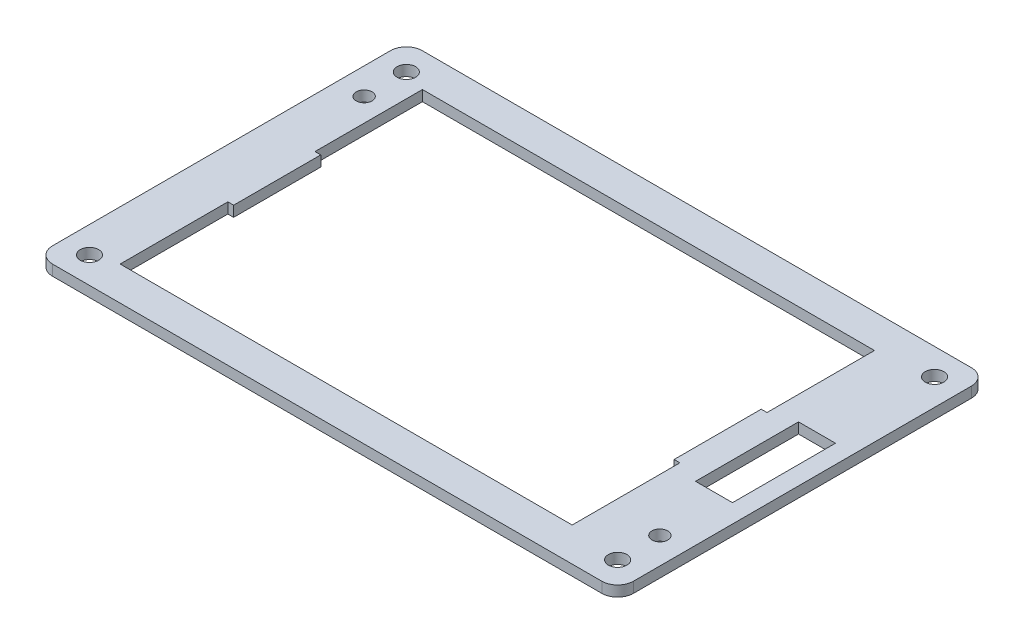
ISO-10303-21;
HEADER;
FILE_DESCRIPTION(('STEP AP214'),'2;1');
FILE_NAME('part.step','',(''),(''),'','','');
FILE_SCHEMA(('AUTOMOTIVE_DESIGN { 1 0 10303 214 1 1 1 1 }'));
ENDSEC;
DATA;
#1=APPLICATION_CONTEXT('core data for automotive mechanical design processes');
#2=APPLICATION_PROTOCOL_DEFINITION('international standard','automotive_design',2000,#1);
#3=PRODUCT_CONTEXT('',#1,'mechanical');
#4=PRODUCT('Part','Part','',(#3));
#5=PRODUCT_RELATED_PRODUCT_CATEGORY('part','',(#4));
#6=PRODUCT_DEFINITION_FORMATION('','',#4);
#7=PRODUCT_DEFINITION_CONTEXT('part definition',#1,'design');
#8=PRODUCT_DEFINITION('design','',#6,#7);
#9=PRODUCT_DEFINITION_SHAPE('','',#8);
#10=(LENGTH_UNIT() NAMED_UNIT(*) SI_UNIT(.MILLI.,.METRE.));
#11=(NAMED_UNIT(*) PLANE_ANGLE_UNIT() SI_UNIT($,.RADIAN.));
#12=(NAMED_UNIT(*) SI_UNIT($,.STERADIAN.) SOLID_ANGLE_UNIT());
#13=UNCERTAINTY_MEASURE_WITH_UNIT(LENGTH_MEASURE(1.E-05),#10,'distance_accuracy_value','');
#14=(GEOMETRIC_REPRESENTATION_CONTEXT(3) GLOBAL_UNCERTAINTY_ASSIGNED_CONTEXT((#13)) GLOBAL_UNIT_ASSIGNED_CONTEXT((#10,
#11,#12)) REPRESENTATION_CONTEXT('',''));
#15=CARTESIAN_POINT('',(0.,0.,0.));
#16=DIRECTION('',(0.,0.,1.));
#17=DIRECTION('',(1.,0.,0.));
#18=AXIS2_PLACEMENT_3D('',#15,#16,#17);
#19=CARTESIAN_POINT('',(0.,2.,0.));
#20=DIRECTION('',(0.,1.,0.));
#21=DIRECTION('',(0.,0.,1.));
#22=AXIS2_PLACEMENT_3D('',#19,#20,#21);
#23=PLANE('',#22);
#24=CARTESIAN_POINT('',(-50.,2.,-22.));
#25=DIRECTION('',(0.,-1.,0.));
#26=DIRECTION('',(0.,0.,-1.));
#27=AXIS2_PLACEMENT_3D('',#24,#25,#26);
#28=CIRCLE('',#27,1.5);
#29=CARTESIAN_POINT('',(-50.,2.,-23.5));
#30=VERTEX_POINT('',#29);
#31=EDGE_CURVE('E791',#30,#30,#28,.T.);
#32=ORIENTED_EDGE('',*,*,#31,.T.);
#33=EDGE_LOOP('',(#32));
#34=FACE_BOUND('',#33,.T.);
#35=CARTESIAN_POINT('',(50.,2.,22.));
#36=DIRECTION('',(0.,-1.,0.));
#37=DIRECTION('',(0.,0.,-1.));
#38=AXIS2_PLACEMENT_3D('',#35,#36,#37);
#39=CIRCLE('',#38,1.5);
#40=CARTESIAN_POINT('',(50.,2.,20.5));
#41=VERTEX_POINT('',#40);
#42=EDGE_CURVE('E231',#41,#41,#39,.T.);
#43=ORIENTED_EDGE('',*,*,#42,.T.);
#44=EDGE_LOOP('',(#43));
#45=FACE_BOUND('',#44,.T.);
#46=DIRECTION('',(0.,0.,1.));
#47=VECTOR('',#46,1.);
#48=CARTESIAN_POINT('',(44.5,2.,9.75000000000002));
#49=LINE('',#48,#47);
#50=CARTESIAN_POINT('',(44.5,2.,-9.74999999999998));
#51=VERTEX_POINT('',#50);
#52=CARTESIAN_POINT('',(44.5,2.,9.75000000000002));
#53=VERTEX_POINT('',#52);
#54=EDGE_CURVE('E200',#51,#53,#49,.T.);
#55=ORIENTED_EDGE('',*,*,#54,.F.);
#56=DIRECTION('',(-1.,0.,0.));
#57=VECTOR('',#56,1.);
#58=CARTESIAN_POINT('',(44.5,2.,-9.74999999999998));
#59=LINE('',#58,#57);
#60=CARTESIAN_POINT('',(51.5,2.,-9.74999999999998));
#61=VERTEX_POINT('',#60);
#62=EDGE_CURVE('E218',#61,#51,#59,.T.);
#63=ORIENTED_EDGE('',*,*,#62,.F.);
#64=DIRECTION('',(0.,0.,-1.));
#65=VECTOR('',#64,1.);
#66=CARTESIAN_POINT('',(51.5,2.,9.75000000000002));
#67=LINE('',#66,#65);
#68=CARTESIAN_POINT('',(51.5,2.,9.75000000000002));
#69=VERTEX_POINT('',#68);
#70=EDGE_CURVE('E221',#69,#61,#67,.T.);
#71=ORIENTED_EDGE('',*,*,#70,.F.);
#72=DIRECTION('',(1.,0.,0.));
#73=VECTOR('',#72,1.);
#74=CARTESIAN_POINT('',(44.5,2.,9.75000000000002));
#75=LINE('',#74,#73);
#76=EDGE_CURVE('E230',#53,#69,#75,.T.);
#77=ORIENTED_EDGE('',*,*,#76,.F.);
#78=EDGE_LOOP('',(#55,#63,#71,#77));
#79=FACE_BOUND('',#78,.T.);
#80=CARTESIAN_POINT('',(50.,2.,30.));
#81=DIRECTION('',(0.,1.,0.));
#82=DIRECTION('',(0.,0.,1.));
#83=AXIS2_PLACEMENT_3D('',#80,#81,#82);
#84=CIRCLE('',#83,1.75);
#85=CARTESIAN_POINT('',(50.,2.,31.75));
#86=VERTEX_POINT('',#85);
#87=EDGE_CURVE('E334',#86,#86,#84,.T.);
#88=ORIENTED_EDGE('',*,*,#87,.F.);
#89=EDGE_LOOP('',(#88));
#90=FACE_BOUND('',#89,.T.);
#91=CARTESIAN_POINT('',(-50.,2.,-30.));
#92=DIRECTION('',(0.,1.,0.));
#93=DIRECTION('',(0.,0.,1.));
#94=AXIS2_PLACEMENT_3D('',#91,#92,#93);
#95=CIRCLE('',#94,1.75);
#96=CARTESIAN_POINT('',(-50.,2.,-28.25));
#97=VERTEX_POINT('',#96);
#98=EDGE_CURVE('E346',#97,#97,#95,.T.);
#99=ORIENTED_EDGE('',*,*,#98,.F.);
#100=EDGE_LOOP('',(#99));
#101=FACE_BOUND('',#100,.T.);
#102=DIRECTION('',(-1.,0.,0.));
#103=VECTOR('',#102,1.);
#104=CARTESIAN_POINT('',(-55.,2.,-35.));
#105=LINE('',#104,#103);
#106=CARTESIAN_POINT('',(52.,2.,-35.0000000000001));
#107=VERTEX_POINT('',#106);
#108=CARTESIAN_POINT('',(-52.,2.,-35.));
#109=VERTEX_POINT('',#108);
#110=EDGE_CURVE('E360',#107,#109,#105,.T.);
#111=ORIENTED_EDGE('',*,*,#110,.T.);
#112=CARTESIAN_POINT('',(-52.,2.,-32.));
#113=DIRECTION('',(0.,1.,0.));
#114=DIRECTION('',(0.,0.,1.));
#115=AXIS2_PLACEMENT_3D('',#112,#113,#114);
#116=CIRCLE('',#115,3.);
#117=CARTESIAN_POINT('',(-55.,2.,-32.));
#118=VERTEX_POINT('',#117);
#119=EDGE_CURVE('E395',#109,#118,#116,.T.);
#120=ORIENTED_EDGE('',*,*,#119,.T.);
#121=DIRECTION('',(0.,0.,1.));
#122=VECTOR('',#121,1.);
#123=CARTESIAN_POINT('',(-55.,2.,-35.));
#124=LINE('',#123,#122);
#125=CARTESIAN_POINT('',(-55.,2.,32.));
#126=VERTEX_POINT('',#125);
#127=EDGE_CURVE('E352',#118,#126,#124,.T.);
#128=ORIENTED_EDGE('',*,*,#127,.T.);
#129=CARTESIAN_POINT('',(-52.,2.,32.));
#130=DIRECTION('',(0.,1.,0.));
#131=DIRECTION('',(0.,0.,1.));
#132=AXIS2_PLACEMENT_3D('',#129,#130,#131);
#133=CIRCLE('',#132,3.);
#134=CARTESIAN_POINT('',(-52.,2.,35.));
#135=VERTEX_POINT('',#134);
#136=EDGE_CURVE('E393',#126,#135,#133,.T.);
#137=ORIENTED_EDGE('',*,*,#136,.T.);
#138=DIRECTION('',(1.,0.,0.));
#139=VECTOR('',#138,1.);
#140=CARTESIAN_POINT('',(-55.,2.,35.));
#141=LINE('',#140,#139);
#142=CARTESIAN_POINT('',(52.,2.,35.));
#143=VERTEX_POINT('',#142);
#144=EDGE_CURVE('E355',#135,#143,#141,.T.);
#145=ORIENTED_EDGE('',*,*,#144,.T.);
#146=CARTESIAN_POINT('',(52.,2.,32.));
#147=DIRECTION('',(0.,1.,0.));
#148=DIRECTION('',(0.,0.,1.));
#149=AXIS2_PLACEMENT_3D('',#146,#147,#148);
#150=CIRCLE('',#149,3.);
#151=CARTESIAN_POINT('',(55.,2.,32.));
#152=VERTEX_POINT('',#151);
#153=EDGE_CURVE('E52',#143,#152,#150,.T.);
#154=ORIENTED_EDGE('',*,*,#153,.T.);
#155=DIRECTION('',(0.,0.,-1.));
#156=VECTOR('',#155,1.);
#157=CARTESIAN_POINT('',(55.,2.,-35.0000000000001));
#158=LINE('',#157,#156);
#159=CARTESIAN_POINT('',(55.,2.,-32.0000000000001));
#160=VERTEX_POINT('',#159);
#161=EDGE_CURVE('E358',#152,#160,#158,.T.);
#162=ORIENTED_EDGE('',*,*,#161,.T.);
#163=CARTESIAN_POINT('',(52.,2.,-32.0000000000001));
#164=DIRECTION('',(0.,1.,0.));
#165=DIRECTION('',(0.,0.,1.));
#166=AXIS2_PLACEMENT_3D('',#163,#164,#165);
#167=CIRCLE('',#166,3.);
#168=EDGE_CURVE('E391',#160,#107,#167,.T.);
#169=ORIENTED_EDGE('',*,*,#168,.T.);
#170=EDGE_LOOP('',(#111,#120,#128,#137,#145,#154,#162,#169));
#171=FACE_BOUND('',#170,.T.);
#172=CARTESIAN_POINT('',(-50.,2.,30.));
#173=DIRECTION('',(0.,1.,0.));
#174=DIRECTION('',(0.,0.,1.));
#175=AXIS2_PLACEMENT_3D('',#172,#173,#174);
#176=CIRCLE('',#175,1.75);
#177=CARTESIAN_POINT('',(-50.,2.,31.75));
#178=VERTEX_POINT('',#177);
#179=EDGE_CURVE('E340',#178,#178,#176,.T.);
#180=ORIENTED_EDGE('',*,*,#179,.F.);
#181=EDGE_LOOP('',(#180));
#182=FACE_BOUND('',#181,.T.);
#183=CARTESIAN_POINT('',(50.,2.,-30.));
#184=DIRECTION('',(0.,1.,0.));
#185=DIRECTION('',(0.,0.,1.));
#186=AXIS2_PLACEMENT_3D('',#183,#184,#185);
#187=CIRCLE('',#186,1.75);
#188=CARTESIAN_POINT('',(50.,2.,-28.25));
#189=VERTEX_POINT('',#188);
#190=EDGE_CURVE('E328',#189,#189,#187,.T.);
#191=ORIENTED_EDGE('',*,*,#190,.F.);
#192=EDGE_LOOP('',(#191));
#193=FACE_BOUND('',#192,.T.);
#194=DIRECTION('',(-1.,0.,0.));
#195=VECTOR('',#194,1.);
#196=CARTESIAN_POINT('',(39.9847783768724,2.,-28.642854689921));
#197=LINE('',#196,#195);
#198=CARTESIAN_POINT('',(39.9847783768724,2.,-28.642854689921));
#199=VERTEX_POINT('',#198);
#200=CARTESIAN_POINT('',(-45.6030332068906,2.,-28.642854689921));
#201=VERTEX_POINT('',#200);
#202=EDGE_CURVE('E243',#199,#201,#197,.T.);
#203=ORIENTED_EDGE('',*,*,#202,.F.);
#204=DIRECTION('',(0.,0.,-1.));
#205=VECTOR('',#204,1.);
#206=CARTESIAN_POINT('',(39.9847783768724,2.,-8.29978499806222));
#207=LINE('',#206,#205);
#208=CARTESIAN_POINT('',(39.9847783768724,2.,-8.29978499806222));
#209=VERTEX_POINT('',#208);
#210=EDGE_CURVE('E241',#209,#199,#207,.T.);
#211=ORIENTED_EDGE('',*,*,#210,.F.);
#212=DIRECTION('',(1.,0.,0.));
#213=VECTOR('',#212,1.);
#214=CARTESIAN_POINT('',(38.89,2.,-8.29978499806221));
#215=LINE('',#214,#213);
#216=CARTESIAN_POINT('',(38.89,2.,-8.29978499806221));
#217=VERTEX_POINT('',#216);
#218=EDGE_CURVE('E265',#217,#209,#215,.T.);
#219=ORIENTED_EDGE('',*,*,#218,.F.);
#220=DIRECTION('',(0.,0.,-1.));
#221=VECTOR('',#220,1.);
#222=CARTESIAN_POINT('',(38.89,2.,8.20021500193779));
#223=LINE('',#222,#221);
#224=CARTESIAN_POINT('',(38.89,2.,8.20021500193779));
#225=VERTEX_POINT('',#224);
#226=EDGE_CURVE('E262',#225,#217,#223,.T.);
#227=ORIENTED_EDGE('',*,*,#226,.F.);
#228=DIRECTION('',(-1.,0.,0.));
#229=VECTOR('',#228,1.);
#230=CARTESIAN_POINT('',(39.9847783768724,2.,8.20021500193779));
#231=LINE('',#230,#229);
#232=CARTESIAN_POINT('',(39.9847783768724,2.,8.20021500193779));
#233=VERTEX_POINT('',#232);
#234=EDGE_CURVE('E260',#233,#225,#231,.T.);
#235=ORIENTED_EDGE('',*,*,#234,.F.);
#236=DIRECTION('',(0.,0.,-1.));
#237=VECTOR('',#236,1.);
#238=CARTESIAN_POINT('',(39.9847783768724,2.,28.5912878880664));
#239=LINE('',#238,#237);
#240=CARTESIAN_POINT('',(39.9847783768724,2.,28.5912878880664));
#241=VERTEX_POINT('',#240);
#242=EDGE_CURVE('E258',#241,#233,#239,.T.);
#243=ORIENTED_EDGE('',*,*,#242,.F.);
#244=DIRECTION('',(1.,0.,0.));
#245=VECTOR('',#244,1.);
#246=CARTESIAN_POINT('',(-45.6030332068906,2.,28.5912878880664));
#247=LINE('',#246,#245);
#248=CARTESIAN_POINT('',(-45.6030332068906,2.,28.5912878880664));
#249=VERTEX_POINT('',#248);
#250=EDGE_CURVE('E256',#249,#241,#247,.T.);
#251=ORIENTED_EDGE('',*,*,#250,.F.);
#252=DIRECTION('',(0.,0.,1.));
#253=VECTOR('',#252,1.);
#254=CARTESIAN_POINT('',(-45.6030332068906,2.,8.20021500193779));
#255=LINE('',#254,#253);
#256=CARTESIAN_POINT('',(-45.6030332068906,2.,8.20021500193779));
#257=VERTEX_POINT('',#256);
#258=EDGE_CURVE('E254',#257,#249,#255,.T.);
#259=ORIENTED_EDGE('',*,*,#258,.F.);
#260=DIRECTION('',(-1.,0.,0.));
#261=VECTOR('',#260,1.);
#262=CARTESIAN_POINT('',(-44.51,2.,8.20021500193779));
#263=LINE('',#262,#261);
#264=CARTESIAN_POINT('',(-44.51,2.,8.20021500193779));
#265=VERTEX_POINT('',#264);
#266=EDGE_CURVE('E252',#265,#257,#263,.T.);
#267=ORIENTED_EDGE('',*,*,#266,.F.);
#268=DIRECTION('',(0.,0.,1.));
#269=VECTOR('',#268,1.);
#270=CARTESIAN_POINT('',(-44.51,2.,-8.29978499806221));
#271=LINE('',#270,#269);
#272=CARTESIAN_POINT('',(-44.51,2.,-8.29978499806221));
#273=VERTEX_POINT('',#272);
#274=EDGE_CURVE('E250',#273,#265,#271,.T.);
#275=ORIENTED_EDGE('',*,*,#274,.F.);
#276=DIRECTION('',(1.,0.,0.));
#277=VECTOR('',#276,1.);
#278=CARTESIAN_POINT('',(-45.6030332068906,2.,-8.29978499806222));
#279=LINE('',#278,#277);
#280=CARTESIAN_POINT('',(-45.6030332068906,2.,-8.29978499806222));
#281=VERTEX_POINT('',#280);
#282=EDGE_CURVE('E248',#281,#273,#279,.T.);
#283=ORIENTED_EDGE('',*,*,#282,.F.);
#284=DIRECTION('',(0.,0.,1.));
#285=VECTOR('',#284,1.);
#286=CARTESIAN_POINT('',(-45.6030332068906,2.,-28.642854689921));
#287=LINE('',#286,#285);
#288=EDGE_CURVE('E246',#201,#281,#287,.T.);
#289=ORIENTED_EDGE('',*,*,#288,.F.);
#290=EDGE_LOOP('',(#203,#211,#219,#227,#235,#243,#251,#259,#267,#275,#283,#289));
#291=FACE_BOUND('',#290,.T.);
#292=ADVANCED_FACE('F32',(#34,#45,#79,#90,#101,#171,#182,#193,#291),#23,.T.);
#293=CARTESIAN_POINT('',(0.,0.,0.));
#294=DIRECTION('',(0.,1.,0.));
#295=DIRECTION('',(0.,0.,1.));
#296=AXIS2_PLACEMENT_3D('',#293,#294,#295);
#297=PLANE('',#296);
#298=CARTESIAN_POINT('',(-50.,0.,-22.));
#299=DIRECTION('',(0.,-1.,0.));
#300=DIRECTION('',(0.,0.,-1.));
#301=AXIS2_PLACEMENT_3D('',#298,#299,#300);
#302=CIRCLE('',#301,1.5);
#303=CARTESIAN_POINT('',(-50.,0.,-23.5));
#304=VERTEX_POINT('',#303);
#305=EDGE_CURVE('E794',#304,#304,#302,.T.);
#306=ORIENTED_EDGE('',*,*,#305,.F.);
#307=EDGE_LOOP('',(#306));
#308=FACE_BOUND('',#307,.T.);
#309=CARTESIAN_POINT('',(50.,0.,22.));
#310=DIRECTION('',(0.,-1.,0.));
#311=DIRECTION('',(0.,0.,-1.));
#312=AXIS2_PLACEMENT_3D('',#309,#310,#311);
#313=CIRCLE('',#312,1.5);
#314=CARTESIAN_POINT('',(50.,0.,20.5));
#315=VERTEX_POINT('',#314);
#316=EDGE_CURVE('E224',#315,#315,#313,.T.);
#317=ORIENTED_EDGE('',*,*,#316,.F.);
#318=EDGE_LOOP('',(#317));
#319=FACE_BOUND('',#318,.T.);
#320=DIRECTION('',(-1.,0.,0.));
#321=VECTOR('',#320,1.);
#322=CARTESIAN_POINT('',(44.5,0.,-9.74999999999998));
#323=LINE('',#322,#321);
#324=CARTESIAN_POINT('',(51.5,0.,-9.74999999999998));
#325=VERTEX_POINT('',#324);
#326=CARTESIAN_POINT('',(44.5,0.,-9.74999999999998));
#327=VERTEX_POINT('',#326);
#328=EDGE_CURVE('E205',#325,#327,#323,.T.);
#329=ORIENTED_EDGE('',*,*,#328,.T.);
#330=DIRECTION('',(0.,0.,1.));
#331=VECTOR('',#330,1.);
#332=CARTESIAN_POINT('',(44.5,0.,9.75000000000002));
#333=LINE('',#332,#331);
#334=CARTESIAN_POINT('',(44.5,0.,9.75000000000002));
#335=VERTEX_POINT('',#334);
#336=EDGE_CURVE('E197',#327,#335,#333,.T.);
#337=ORIENTED_EDGE('',*,*,#336,.T.);
#338=DIRECTION('',(1.,0.,0.));
#339=VECTOR('',#338,1.);
#340=CARTESIAN_POINT('',(44.5,0.,9.75000000000002));
#341=LINE('',#340,#339);
#342=CARTESIAN_POINT('',(51.5,0.,9.75000000000002));
#343=VERTEX_POINT('',#342);
#344=EDGE_CURVE('E209',#335,#343,#341,.T.);
#345=ORIENTED_EDGE('',*,*,#344,.T.);
#346=DIRECTION('',(0.,0.,-1.));
#347=VECTOR('',#346,1.);
#348=CARTESIAN_POINT('',(51.5,0.,9.75000000000002));
#349=LINE('',#348,#347);
#350=EDGE_CURVE('E213',#343,#325,#349,.T.);
#351=ORIENTED_EDGE('',*,*,#350,.T.);
#352=EDGE_LOOP('',(#329,#337,#345,#351));
#353=FACE_BOUND('',#352,.T.);
#354=CARTESIAN_POINT('',(50.,0.,-30.));
#355=DIRECTION('',(0.,1.,0.));
#356=DIRECTION('',(0.,0.,1.));
#357=AXIS2_PLACEMENT_3D('',#354,#355,#356);
#358=CIRCLE('',#357,1.75);
#359=CARTESIAN_POINT('',(50.,0.,-28.25));
#360=VERTEX_POINT('',#359);
#361=EDGE_CURVE('E327',#360,#360,#358,.T.);
#362=ORIENTED_EDGE('',*,*,#361,.T.);
#363=EDGE_LOOP('',(#362));
#364=FACE_BOUND('',#363,.T.);
#365=CARTESIAN_POINT('',(50.,0.,30.));
#366=DIRECTION('',(0.,1.,0.));
#367=DIRECTION('',(0.,0.,1.));
#368=AXIS2_PLACEMENT_3D('',#365,#366,#367);
#369=CIRCLE('',#368,1.75);
#370=CARTESIAN_POINT('',(50.,0.,31.75));
#371=VERTEX_POINT('',#370);
#372=EDGE_CURVE('E331',#371,#371,#369,.T.);
#373=ORIENTED_EDGE('',*,*,#372,.T.);
#374=EDGE_LOOP('',(#373));
#375=FACE_BOUND('',#374,.T.);
#376=CARTESIAN_POINT('',(-50.,0.,30.));
#377=DIRECTION('',(0.,1.,0.));
#378=DIRECTION('',(0.,0.,1.));
#379=AXIS2_PLACEMENT_3D('',#376,#377,#378);
#380=CIRCLE('',#379,1.75);
#381=CARTESIAN_POINT('',(-50.,0.,31.75));
#382=VERTEX_POINT('',#381);
#383=EDGE_CURVE('E337',#382,#382,#380,.T.);
#384=ORIENTED_EDGE('',*,*,#383,.T.);
#385=EDGE_LOOP('',(#384));
#386=FACE_BOUND('',#385,.T.);
#387=CARTESIAN_POINT('',(-50.,0.,-30.));
#388=DIRECTION('',(0.,1.,0.));
#389=DIRECTION('',(0.,0.,1.));
#390=AXIS2_PLACEMENT_3D('',#387,#388,#389);
#391=CIRCLE('',#390,1.75);
#392=CARTESIAN_POINT('',(-50.,0.,-28.25));
#393=VERTEX_POINT('',#392);
#394=EDGE_CURVE('E343',#393,#393,#391,.T.);
#395=ORIENTED_EDGE('',*,*,#394,.T.);
#396=EDGE_LOOP('',(#395));
#397=FACE_BOUND('',#396,.T.);
#398=DIRECTION('',(0.,0.,1.));
#399=VECTOR('',#398,1.);
#400=CARTESIAN_POINT('',(-55.,0.,-35.));
#401=LINE('',#400,#399);
#402=CARTESIAN_POINT('',(-55.,0.,-32.));
#403=VERTEX_POINT('',#402);
#404=CARTESIAN_POINT('',(-55.,0.,32.));
#405=VERTEX_POINT('',#404);
#406=EDGE_CURVE('E349',#403,#405,#401,.T.);
#407=ORIENTED_EDGE('',*,*,#406,.F.);
#408=CARTESIAN_POINT('',(-52.,0.,-32.));
#409=DIRECTION('',(0.,1.,0.));
#410=DIRECTION('',(0.,0.,1.));
#411=AXIS2_PLACEMENT_3D('',#408,#409,#410);
#412=CIRCLE('',#411,3.);
#413=CARTESIAN_POINT('',(-52.,0.,-35.));
#414=VERTEX_POINT('',#413);
#415=EDGE_CURVE('E383',#403,#414,#412,.F.);
#416=ORIENTED_EDGE('',*,*,#415,.T.);
#417=DIRECTION('',(-1.,0.,0.));
#418=VECTOR('',#417,1.);
#419=CARTESIAN_POINT('',(-55.,0.,-35.));
#420=LINE('',#419,#418);
#421=CARTESIAN_POINT('',(52.,0.,-35.0000000000001));
#422=VERTEX_POINT('',#421);
#423=EDGE_CURVE('E356',#422,#414,#420,.T.);
#424=ORIENTED_EDGE('',*,*,#423,.F.);
#425=CARTESIAN_POINT('',(52.,0.,-32.0000000000001));
#426=DIRECTION('',(0.,1.,0.));
#427=DIRECTION('',(0.,0.,1.));
#428=AXIS2_PLACEMENT_3D('',#425,#426,#427);
#429=CIRCLE('',#428,3.);
#430=CARTESIAN_POINT('',(55.,0.,-32.0000000000001));
#431=VERTEX_POINT('',#430);
#432=EDGE_CURVE('E379',#422,#431,#429,.F.);
#433=ORIENTED_EDGE('',*,*,#432,.T.);
#434=DIRECTION('',(0.,0.,-1.));
#435=VECTOR('',#434,1.);
#436=CARTESIAN_POINT('',(55.,0.,-35.0000000000001));
#437=LINE('',#436,#435);
#438=CARTESIAN_POINT('',(55.,0.,32.));
#439=VERTEX_POINT('',#438);
#440=EDGE_CURVE('E369',#439,#431,#437,.T.);
#441=ORIENTED_EDGE('',*,*,#440,.F.);
#442=CARTESIAN_POINT('',(52.,0.,32.));
#443=DIRECTION('',(0.,1.,0.));
#444=DIRECTION('',(0.,0.,1.));
#445=AXIS2_PLACEMENT_3D('',#442,#443,#444);
#446=CIRCLE('',#445,3.);
#447=CARTESIAN_POINT('',(52.,0.,35.));
#448=VERTEX_POINT('',#447);
#449=EDGE_CURVE('E377',#439,#448,#446,.F.);
#450=ORIENTED_EDGE('',*,*,#449,.T.);
#451=DIRECTION('',(1.,0.,0.));
#452=VECTOR('',#451,1.);
#453=CARTESIAN_POINT('',(-55.,0.,35.));
#454=LINE('',#453,#452);
#455=CARTESIAN_POINT('',(-52.,0.,35.));
#456=VERTEX_POINT('',#455);
#457=EDGE_CURVE('E366',#456,#448,#454,.T.);
#458=ORIENTED_EDGE('',*,*,#457,.F.);
#459=CARTESIAN_POINT('',(-52.,0.,32.));
#460=DIRECTION('',(0.,1.,0.));
#461=DIRECTION('',(0.,0.,1.));
#462=AXIS2_PLACEMENT_3D('',#459,#460,#461);
#463=CIRCLE('',#462,3.);
#464=EDGE_CURVE('E381',#456,#405,#463,.F.);
#465=ORIENTED_EDGE('',*,*,#464,.T.);
#466=EDGE_LOOP('',(#407,#416,#424,#433,#441,#450,#458,#465));
#467=FACE_BOUND('',#466,.T.);
#468=DIRECTION('',(0.,0.,-1.));
#469=VECTOR('',#468,1.);
#470=CARTESIAN_POINT('',(39.9847783768724,0.,-8.29978499806222));
#471=LINE('',#470,#469);
#472=CARTESIAN_POINT('',(39.9847783768724,0.,-8.29978499806222));
#473=VERTEX_POINT('',#472);
#474=CARTESIAN_POINT('',(39.9847783768724,0.,-28.642854689921));
#475=VERTEX_POINT('',#474);
#476=EDGE_CURVE('E237',#473,#475,#471,.T.);
#477=ORIENTED_EDGE('',*,*,#476,.T.);
#478=DIRECTION('',(-1.,0.,0.));
#479=VECTOR('',#478,1.);
#480=CARTESIAN_POINT('',(39.9847783768724,0.,-28.642854689921));
#481=LINE('',#480,#479);
#482=CARTESIAN_POINT('',(-45.6030332068906,0.,-28.642854689921));
#483=VERTEX_POINT('',#482);
#484=EDGE_CURVE('E270',#475,#483,#481,.T.);
#485=ORIENTED_EDGE('',*,*,#484,.T.);
#486=DIRECTION('',(0.,0.,1.));
#487=VECTOR('',#486,1.);
#488=CARTESIAN_POINT('',(-45.6030332068906,0.,-28.642854689921));
#489=LINE('',#488,#487);
#490=CARTESIAN_POINT('',(-45.6030332068906,0.,-8.29978499806222));
#491=VERTEX_POINT('',#490);
#492=EDGE_CURVE('E273',#483,#491,#489,.T.);
#493=ORIENTED_EDGE('',*,*,#492,.T.);
#494=DIRECTION('',(1.,0.,0.));
#495=VECTOR('',#494,1.);
#496=CARTESIAN_POINT('',(-45.6030332068906,0.,-8.29978499806222));
#497=LINE('',#496,#495);
#498=CARTESIAN_POINT('',(-44.51,0.,-8.29978499806221));
#499=VERTEX_POINT('',#498);
#500=EDGE_CURVE('E276',#491,#499,#497,.T.);
#501=ORIENTED_EDGE('',*,*,#500,.T.);
#502=DIRECTION('',(0.,0.,1.));
#503=VECTOR('',#502,1.);
#504=CARTESIAN_POINT('',(-44.51,0.,-8.29978499806221));
#505=LINE('',#504,#503);
#506=CARTESIAN_POINT('',(-44.51,0.,8.20021500193779));
#507=VERTEX_POINT('',#506);
#508=EDGE_CURVE('E279',#499,#507,#505,.T.);
#509=ORIENTED_EDGE('',*,*,#508,.T.);
#510=DIRECTION('',(-1.,0.,0.));
#511=VECTOR('',#510,1.);
#512=CARTESIAN_POINT('',(-44.51,0.,8.20021500193779));
#513=LINE('',#512,#511);
#514=CARTESIAN_POINT('',(-45.6030332068906,0.,8.20021500193779));
#515=VERTEX_POINT('',#514);
#516=EDGE_CURVE('E282',#507,#515,#513,.T.);
#517=ORIENTED_EDGE('',*,*,#516,.T.);
#518=DIRECTION('',(0.,0.,1.));
#519=VECTOR('',#518,1.);
#520=CARTESIAN_POINT('',(-45.6030332068906,0.,8.20021500193779));
#521=LINE('',#520,#519);
#522=CARTESIAN_POINT('',(-45.6030332068906,0.,28.5912878880664));
#523=VERTEX_POINT('',#522);
#524=EDGE_CURVE('E285',#515,#523,#521,.T.);
#525=ORIENTED_EDGE('',*,*,#524,.T.);
#526=DIRECTION('',(1.,0.,0.));
#527=VECTOR('',#526,1.);
#528=CARTESIAN_POINT('',(-45.6030332068906,0.,28.5912878880664));
#529=LINE('',#528,#527);
#530=CARTESIAN_POINT('',(39.9847783768724,0.,28.5912878880664));
#531=VERTEX_POINT('',#530);
#532=EDGE_CURVE('E288',#523,#531,#529,.T.);
#533=ORIENTED_EDGE('',*,*,#532,.T.);
#534=DIRECTION('',(0.,0.,-1.));
#535=VECTOR('',#534,1.);
#536=CARTESIAN_POINT('',(39.9847783768724,0.,28.5912878880664));
#537=LINE('',#536,#535);
#538=CARTESIAN_POINT('',(39.9847783768724,0.,8.20021500193779));
#539=VERTEX_POINT('',#538);
#540=EDGE_CURVE('E291',#531,#539,#537,.T.);
#541=ORIENTED_EDGE('',*,*,#540,.T.);
#542=DIRECTION('',(-1.,0.,0.));
#543=VECTOR('',#542,1.);
#544=CARTESIAN_POINT('',(39.9847783768724,0.,8.20021500193779));
#545=LINE('',#544,#543);
#546=CARTESIAN_POINT('',(38.89,0.,8.20021500193779));
#547=VERTEX_POINT('',#546);
#548=EDGE_CURVE('E294',#539,#547,#545,.T.);
#549=ORIENTED_EDGE('',*,*,#548,.T.);
#550=DIRECTION('',(0.,0.,-1.));
#551=VECTOR('',#550,1.);
#552=CARTESIAN_POINT('',(38.89,0.,8.20021500193779));
#553=LINE('',#552,#551);
#554=CARTESIAN_POINT('',(38.89,0.,-8.29978499806221));
#555=VERTEX_POINT('',#554);
#556=EDGE_CURVE('E297',#547,#555,#553,.T.);
#557=ORIENTED_EDGE('',*,*,#556,.T.);
#558=DIRECTION('',(1.,0.,0.));
#559=VECTOR('',#558,1.);
#560=CARTESIAN_POINT('',(38.89,0.,-8.29978499806221));
#561=LINE('',#560,#559);
#562=EDGE_CURVE('E244',#555,#473,#561,.T.);
#563=ORIENTED_EDGE('',*,*,#562,.T.);
#564=EDGE_LOOP('',(#477,#485,#493,#501,#509,#517,#525,#533,#541,#549,#557,#563));
#565=FACE_BOUND('',#564,.T.);
#566=ADVANCED_FACE('F215',(#308,#319,#353,#364,#375,#386,#397,#467,#565),#297,.F.);
#567=CARTESIAN_POINT('',(-55.,2.,-35.));
#568=DIRECTION('',(1.,0.,0.));
#569=DIRECTION('',(0.,0.,-1.));
#570=AXIS2_PLACEMENT_3D('',#567,#568,#569);
#571=PLANE('',#570);
#572=ORIENTED_EDGE('',*,*,#127,.F.);
#573=DIRECTION('',(0.,-1.,0.));
#574=VECTOR('',#573,1.);
#575=CARTESIAN_POINT('',(-55.,2.,-32.));
#576=LINE('',#575,#574);
#577=EDGE_CURVE('E374',#118,#403,#576,.T.);
#578=ORIENTED_EDGE('',*,*,#577,.T.);
#579=ORIENTED_EDGE('',*,*,#406,.T.);
#580=DIRECTION('',(0.,-1.,0.));
#581=VECTOR('',#580,1.);
#582=CARTESIAN_POINT('',(-55.,2.,32.));
#583=LINE('',#582,#581);
#584=EDGE_CURVE('E363',#405,#126,#583,.F.);
#585=ORIENTED_EDGE('',*,*,#584,.T.);
#586=EDGE_LOOP('',(#572,#578,#579,#585));
#587=FACE_BOUND('',#586,.T.);
#588=ADVANCED_FACE('F426',(#587),#571,.F.);
#589=CARTESIAN_POINT('',(-55.,2.,35.));
#590=DIRECTION('',(0.,0.,-1.));
#591=DIRECTION('',(-1.,0.,0.));
#592=AXIS2_PLACEMENT_3D('',#589,#590,#591);
#593=PLANE('',#592);
#594=ORIENTED_EDGE('',*,*,#144,.F.);
#595=DIRECTION('',(0.,-1.,0.));
#596=VECTOR('',#595,1.);
#597=CARTESIAN_POINT('',(-52.,2.,35.));
#598=LINE('',#597,#596);
#599=EDGE_CURVE('E399',#135,#456,#598,.T.);
#600=ORIENTED_EDGE('',*,*,#599,.T.);
#601=ORIENTED_EDGE('',*,*,#457,.T.);
#602=DIRECTION('',(0.,-1.,0.));
#603=VECTOR('',#602,1.);
#604=CARTESIAN_POINT('',(52.,2.,35.));
#605=LINE('',#604,#603);
#606=EDGE_CURVE('E397',#448,#143,#605,.F.);
#607=ORIENTED_EDGE('',*,*,#606,.T.);
#608=EDGE_LOOP('',(#594,#600,#601,#607));
#609=FACE_BOUND('',#608,.T.);
#610=ADVANCED_FACE('F434',(#609),#593,.F.);
#611=CARTESIAN_POINT('',(55.,2.,-35.0000000000001));
#612=DIRECTION('',(-1.,0.,0.));
#613=DIRECTION('',(0.,0.,1.));
#614=AXIS2_PLACEMENT_3D('',#611,#612,#613);
#615=PLANE('',#614);
#616=ORIENTED_EDGE('',*,*,#440,.T.);
#617=DIRECTION('',(0.,-1.,0.));
#618=VECTOR('',#617,1.);
#619=CARTESIAN_POINT('',(55.,2.,-32.0000000000001));
#620=LINE('',#619,#618);
#621=EDGE_CURVE('E11',#431,#160,#620,.F.);
#622=ORIENTED_EDGE('',*,*,#621,.T.);
#623=ORIENTED_EDGE('',*,*,#161,.F.);
#624=DIRECTION('',(0.,-1.,0.));
#625=VECTOR('',#624,1.);
#626=CARTESIAN_POINT('',(55.,2.,32.));
#627=LINE('',#626,#625);
#628=EDGE_CURVE('E40',#152,#439,#627,.T.);
#629=ORIENTED_EDGE('',*,*,#628,.T.);
#630=EDGE_LOOP('',(#616,#622,#623,#629));
#631=FACE_BOUND('',#630,.T.);
#632=ADVANCED_FACE('F404',(#631),#615,.F.);
#633=CARTESIAN_POINT('',(-55.,2.,-35.));
#634=DIRECTION('',(0.,0.,1.));
#635=DIRECTION('',(1.,0.,0.));
#636=AXIS2_PLACEMENT_3D('',#633,#634,#635);
#637=PLANE('',#636);
#638=ORIENTED_EDGE('',*,*,#423,.T.);
#639=DIRECTION('',(0.,-1.,0.));
#640=VECTOR('',#639,1.);
#641=CARTESIAN_POINT('',(-52.,2.,-35.));
#642=LINE('',#641,#640);
#643=EDGE_CURVE('E388',#414,#109,#642,.F.);
#644=ORIENTED_EDGE('',*,*,#643,.T.);
#645=ORIENTED_EDGE('',*,*,#110,.F.);
#646=DIRECTION('',(0.,-1.,0.));
#647=VECTOR('',#646,1.);
#648=CARTESIAN_POINT('',(52.,2.,-35.0000000000001));
#649=LINE('',#648,#647);
#650=EDGE_CURVE('E385',#107,#422,#649,.T.);
#651=ORIENTED_EDGE('',*,*,#650,.T.);
#652=EDGE_LOOP('',(#638,#644,#645,#651));
#653=FACE_BOUND('',#652,.T.);
#654=ADVANCED_FACE('F417',(#653),#637,.F.);
#655=CARTESIAN_POINT('',(-50.,2.,-30.));
#656=DIRECTION('',(0.,-1.,0.));
#657=DIRECTION('',(0.,0.,-1.));
#658=AXIS2_PLACEMENT_3D('',#655,#656,#657);
#659=CYLINDRICAL_SURFACE('',#658,1.75);
#660=ORIENTED_EDGE('',*,*,#98,.T.);
#661=EDGE_LOOP('',(#660));
#662=FACE_BOUND('',#661,.T.);
#663=ORIENTED_EDGE('',*,*,#394,.F.);
#664=EDGE_LOOP('',(#663));
#665=FACE_BOUND('',#664,.T.);
#666=ADVANCED_FACE('F456',(#662,#665),#659,.F.);
#667=CARTESIAN_POINT('',(-50.,2.,30.));
#668=DIRECTION('',(0.,-1.,0.));
#669=DIRECTION('',(0.,0.,-1.));
#670=AXIS2_PLACEMENT_3D('',#667,#668,#669);
#671=CYLINDRICAL_SURFACE('',#670,1.75);
#672=ORIENTED_EDGE('',*,*,#179,.T.);
#673=EDGE_LOOP('',(#672));
#674=FACE_BOUND('',#673,.T.);
#675=ORIENTED_EDGE('',*,*,#383,.F.);
#676=EDGE_LOOP('',(#675));
#677=FACE_BOUND('',#676,.T.);
#678=ADVANCED_FACE('F581',(#674,#677),#671,.F.);
#679=CARTESIAN_POINT('',(50.,2.,30.));
#680=DIRECTION('',(0.,-1.,0.));
#681=DIRECTION('',(0.,0.,-1.));
#682=AXIS2_PLACEMENT_3D('',#679,#680,#681);
#683=CYLINDRICAL_SURFACE('',#682,1.75);
#684=ORIENTED_EDGE('',*,*,#87,.T.);
#685=EDGE_LOOP('',(#684));
#686=FACE_BOUND('',#685,.T.);
#687=ORIENTED_EDGE('',*,*,#372,.F.);
#688=EDGE_LOOP('',(#687));
#689=FACE_BOUND('',#688,.T.);
#690=ADVANCED_FACE('F578',(#686,#689),#683,.F.);
#691=CARTESIAN_POINT('',(50.,2.,-30.));
#692=DIRECTION('',(0.,-1.,0.));
#693=DIRECTION('',(0.,0.,-1.));
#694=AXIS2_PLACEMENT_3D('',#691,#692,#693);
#695=CYLINDRICAL_SURFACE('',#694,1.75);
#696=ORIENTED_EDGE('',*,*,#190,.T.);
#697=EDGE_LOOP('',(#696));
#698=FACE_BOUND('',#697,.T.);
#699=ORIENTED_EDGE('',*,*,#361,.F.);
#700=EDGE_LOOP('',(#699));
#701=FACE_BOUND('',#700,.T.);
#702=ADVANCED_FACE('F574',(#698,#701),#695,.F.);
#703=CARTESIAN_POINT('',(39.9847783768724,2.,-8.29978499806222));
#704=DIRECTION('',(-1.,0.,0.));
#705=DIRECTION('',(0.,0.,1.));
#706=AXIS2_PLACEMENT_3D('',#703,#704,#705);
#707=PLANE('',#706);
#708=ORIENTED_EDGE('',*,*,#476,.F.);
#709=DIRECTION('',(0.,-1.,0.));
#710=VECTOR('',#709,1.);
#711=CARTESIAN_POINT('',(39.9847783768724,2.,-8.29978499806222));
#712=LINE('',#711,#710);
#713=EDGE_CURVE('E267',#209,#473,#712,.T.);
#714=ORIENTED_EDGE('',*,*,#713,.F.);
#715=ORIENTED_EDGE('',*,*,#210,.T.);
#716=DIRECTION('',(0.,-1.,0.));
#717=VECTOR('',#716,1.);
#718=CARTESIAN_POINT('',(39.9847783768724,2.,-28.642854689921));
#719=LINE('',#718,#717);
#720=EDGE_CURVE('E324',#199,#475,#719,.T.);
#721=ORIENTED_EDGE('',*,*,#720,.T.);
#722=EDGE_LOOP('',(#708,#714,#715,#721));
#723=FACE_BOUND('',#722,.T.);
#724=ADVANCED_FACE('F570',(#723),#707,.T.);
#725=CARTESIAN_POINT('',(39.9847783768724,2.,-28.642854689921));
#726=DIRECTION('',(0.,0.,1.));
#727=DIRECTION('',(1.,0.,0.));
#728=AXIS2_PLACEMENT_3D('',#725,#726,#727);
#729=PLANE('',#728);
#730=ORIENTED_EDGE('',*,*,#484,.F.);
#731=ORIENTED_EDGE('',*,*,#720,.F.);
#732=ORIENTED_EDGE('',*,*,#202,.T.);
#733=DIRECTION('',(0.,-1.,0.));
#734=VECTOR('',#733,1.);
#735=CARTESIAN_POINT('',(-45.6030332068906,2.,-28.642854689921));
#736=LINE('',#735,#734);
#737=EDGE_CURVE('E322',#201,#483,#736,.T.);
#738=ORIENTED_EDGE('',*,*,#737,.T.);
#739=EDGE_LOOP('',(#730,#731,#732,#738));
#740=FACE_BOUND('',#739,.T.);
#741=ADVANCED_FACE('F566',(#740),#729,.T.);
#742=CARTESIAN_POINT('',(-45.6030332068906,2.,-28.642854689921));
#743=DIRECTION('',(1.,0.,0.));
#744=DIRECTION('',(0.,0.,-1.));
#745=AXIS2_PLACEMENT_3D('',#742,#743,#744);
#746=PLANE('',#745);
#747=ORIENTED_EDGE('',*,*,#492,.F.);
#748=ORIENTED_EDGE('',*,*,#737,.F.);
#749=ORIENTED_EDGE('',*,*,#288,.T.);
#750=DIRECTION('',(0.,-1.,0.));
#751=VECTOR('',#750,1.);
#752=CARTESIAN_POINT('',(-45.6030332068906,2.,-8.29978499806222));
#753=LINE('',#752,#751);
#754=EDGE_CURVE('E320',#281,#491,#753,.T.);
#755=ORIENTED_EDGE('',*,*,#754,.T.);
#756=EDGE_LOOP('',(#747,#748,#749,#755));
#757=FACE_BOUND('',#756,.T.);
#758=ADVANCED_FACE('F562',(#757),#746,.T.);
#759=CARTESIAN_POINT('',(-45.6030332068906,2.,-8.29978499806222));
#760=DIRECTION('',(0.,0.,-1.));
#761=DIRECTION('',(-1.,0.,0.));
#762=AXIS2_PLACEMENT_3D('',#759,#760,#761);
#763=PLANE('',#762);
#764=ORIENTED_EDGE('',*,*,#500,.F.);
#765=ORIENTED_EDGE('',*,*,#754,.F.);
#766=ORIENTED_EDGE('',*,*,#282,.T.);
#767=DIRECTION('',(0.,-1.,0.));
#768=VECTOR('',#767,1.);
#769=CARTESIAN_POINT('',(-44.51,2.,-8.29978499806221));
#770=LINE('',#769,#768);
#771=EDGE_CURVE('E318',#273,#499,#770,.T.);
#772=ORIENTED_EDGE('',*,*,#771,.T.);
#773=EDGE_LOOP('',(#764,#765,#766,#772));
#774=FACE_BOUND('',#773,.T.);
#775=ADVANCED_FACE('F558',(#774),#763,.T.);
#776=CARTESIAN_POINT('',(-44.51,2.,-8.29978499806221));
#777=DIRECTION('',(1.,0.,0.));
#778=DIRECTION('',(0.,0.,-1.));
#779=AXIS2_PLACEMENT_3D('',#776,#777,#778);
#780=PLANE('',#779);
#781=ORIENTED_EDGE('',*,*,#508,.F.);
#782=ORIENTED_EDGE('',*,*,#771,.F.);
#783=ORIENTED_EDGE('',*,*,#274,.T.);
#784=DIRECTION('',(0.,-1.,0.));
#785=VECTOR('',#784,1.);
#786=CARTESIAN_POINT('',(-44.51,2.,8.20021500193779));
#787=LINE('',#786,#785);
#788=EDGE_CURVE('E316',#265,#507,#787,.T.);
#789=ORIENTED_EDGE('',*,*,#788,.T.);
#790=EDGE_LOOP('',(#781,#782,#783,#789));
#791=FACE_BOUND('',#790,.T.);
#792=ADVANCED_FACE('F554',(#791),#780,.T.);
#793=CARTESIAN_POINT('',(-44.51,2.,8.20021500193779));
#794=DIRECTION('',(0.,0.,1.));
#795=DIRECTION('',(1.,0.,0.));
#796=AXIS2_PLACEMENT_3D('',#793,#794,#795);
#797=PLANE('',#796);
#798=ORIENTED_EDGE('',*,*,#516,.F.);
#799=ORIENTED_EDGE('',*,*,#788,.F.);
#800=ORIENTED_EDGE('',*,*,#266,.T.);
#801=DIRECTION('',(0.,-1.,0.));
#802=VECTOR('',#801,1.);
#803=CARTESIAN_POINT('',(-45.6030332068906,2.,8.20021500193779));
#804=LINE('',#803,#802);
#805=EDGE_CURVE('E314',#257,#515,#804,.T.);
#806=ORIENTED_EDGE('',*,*,#805,.T.);
#807=EDGE_LOOP('',(#798,#799,#800,#806));
#808=FACE_BOUND('',#807,.T.);
#809=ADVANCED_FACE('F550',(#808),#797,.T.);
#810=CARTESIAN_POINT('',(-45.6030332068906,2.,8.20021500193779));
#811=DIRECTION('',(1.,0.,0.));
#812=DIRECTION('',(0.,0.,-1.));
#813=AXIS2_PLACEMENT_3D('',#810,#811,#812);
#814=PLANE('',#813);
#815=ORIENTED_EDGE('',*,*,#524,.F.);
#816=ORIENTED_EDGE('',*,*,#805,.F.);
#817=ORIENTED_EDGE('',*,*,#258,.T.);
#818=DIRECTION('',(0.,-1.,0.));
#819=VECTOR('',#818,1.);
#820=CARTESIAN_POINT('',(-45.6030332068906,2.,28.5912878880664));
#821=LINE('',#820,#819);
#822=EDGE_CURVE('E312',#249,#523,#821,.T.);
#823=ORIENTED_EDGE('',*,*,#822,.T.);
#824=EDGE_LOOP('',(#815,#816,#817,#823));
#825=FACE_BOUND('',#824,.T.);
#826=ADVANCED_FACE('F546',(#825),#814,.T.);
#827=CARTESIAN_POINT('',(-45.6030332068906,2.,28.5912878880664));
#828=DIRECTION('',(0.,0.,-1.));
#829=DIRECTION('',(-1.,0.,0.));
#830=AXIS2_PLACEMENT_3D('',#827,#828,#829);
#831=PLANE('',#830);
#832=ORIENTED_EDGE('',*,*,#532,.F.);
#833=ORIENTED_EDGE('',*,*,#822,.F.);
#834=ORIENTED_EDGE('',*,*,#250,.T.);
#835=DIRECTION('',(0.,-1.,0.));
#836=VECTOR('',#835,1.);
#837=CARTESIAN_POINT('',(39.9847783768724,2.,28.5912878880664));
#838=LINE('',#837,#836);
#839=EDGE_CURVE('E310',#241,#531,#838,.T.);
#840=ORIENTED_EDGE('',*,*,#839,.T.);
#841=EDGE_LOOP('',(#832,#833,#834,#840));
#842=FACE_BOUND('',#841,.T.);
#843=ADVANCED_FACE('F542',(#842),#831,.T.);
#844=CARTESIAN_POINT('',(39.9847783768724,2.,28.5912878880664));
#845=DIRECTION('',(-1.,0.,0.));
#846=DIRECTION('',(0.,0.,1.));
#847=AXIS2_PLACEMENT_3D('',#844,#845,#846);
#848=PLANE('',#847);
#849=ORIENTED_EDGE('',*,*,#540,.F.);
#850=ORIENTED_EDGE('',*,*,#839,.F.);
#851=ORIENTED_EDGE('',*,*,#242,.T.);
#852=DIRECTION('',(0.,-1.,0.));
#853=VECTOR('',#852,1.);
#854=CARTESIAN_POINT('',(39.9847783768724,2.,8.20021500193779));
#855=LINE('',#854,#853);
#856=EDGE_CURVE('E308',#233,#539,#855,.T.);
#857=ORIENTED_EDGE('',*,*,#856,.T.);
#858=EDGE_LOOP('',(#849,#850,#851,#857));
#859=FACE_BOUND('',#858,.T.);
#860=ADVANCED_FACE('F538',(#859),#848,.T.);
#861=CARTESIAN_POINT('',(39.9847783768724,2.,8.20021500193779));
#862=DIRECTION('',(0.,0.,1.));
#863=DIRECTION('',(1.,0.,0.));
#864=AXIS2_PLACEMENT_3D('',#861,#862,#863);
#865=PLANE('',#864);
#866=ORIENTED_EDGE('',*,*,#548,.F.);
#867=ORIENTED_EDGE('',*,*,#856,.F.);
#868=ORIENTED_EDGE('',*,*,#234,.T.);
#869=DIRECTION('',(0.,-1.,0.));
#870=VECTOR('',#869,1.);
#871=CARTESIAN_POINT('',(38.89,2.,8.20021500193779));
#872=LINE('',#871,#870);
#873=EDGE_CURVE('E306',#225,#547,#872,.T.);
#874=ORIENTED_EDGE('',*,*,#873,.T.);
#875=EDGE_LOOP('',(#866,#867,#868,#874));
#876=FACE_BOUND('',#875,.T.);
#877=ADVANCED_FACE('F534',(#876),#865,.T.);
#878=CARTESIAN_POINT('',(38.89,2.,8.20021500193779));
#879=DIRECTION('',(-1.,0.,0.));
#880=DIRECTION('',(0.,0.,1.));
#881=AXIS2_PLACEMENT_3D('',#878,#879,#880);
#882=PLANE('',#881);
#883=ORIENTED_EDGE('',*,*,#556,.F.);
#884=ORIENTED_EDGE('',*,*,#873,.F.);
#885=ORIENTED_EDGE('',*,*,#226,.T.);
#886=DIRECTION('',(0.,-1.,0.));
#887=VECTOR('',#886,1.);
#888=CARTESIAN_POINT('',(38.89,2.,-8.29978499806221));
#889=LINE('',#888,#887);
#890=EDGE_CURVE('E304',#217,#555,#889,.T.);
#891=ORIENTED_EDGE('',*,*,#890,.T.);
#892=EDGE_LOOP('',(#883,#884,#885,#891));
#893=FACE_BOUND('',#892,.T.);
#894=ADVANCED_FACE('F530',(#893),#882,.T.);
#895=CARTESIAN_POINT('',(38.89,2.,-8.29978499806221));
#896=DIRECTION('',(0.,0.,-1.));
#897=DIRECTION('',(-1.,0.,0.));
#898=AXIS2_PLACEMENT_3D('',#895,#896,#897);
#899=PLANE('',#898);
#900=ORIENTED_EDGE('',*,*,#562,.F.);
#901=ORIENTED_EDGE('',*,*,#890,.F.);
#902=ORIENTED_EDGE('',*,*,#218,.T.);
#903=ORIENTED_EDGE('',*,*,#713,.T.);
#904=EDGE_LOOP('',(#900,#901,#902,#903));
#905=FACE_BOUND('',#904,.T.);
#906=ADVANCED_FACE('F527',(#905),#899,.T.);
#907=CARTESIAN_POINT('',(44.5,0.,9.75000000000002));
#908=DIRECTION('',(-1.,0.,0.));
#909=DIRECTION('',(0.,0.,1.));
#910=AXIS2_PLACEMENT_3D('',#907,#908,#909);
#911=PLANE('',#910);
#912=ORIENTED_EDGE('',*,*,#54,.T.);
#913=DIRECTION('',(0.,1.,0.));
#914=VECTOR('',#913,1.);
#915=CARTESIAN_POINT('',(44.5,0.,9.75000000000002));
#916=LINE('',#915,#914);
#917=EDGE_CURVE('E193',#335,#53,#916,.T.);
#918=ORIENTED_EDGE('',*,*,#917,.F.);
#919=ORIENTED_EDGE('',*,*,#336,.F.);
#920=DIRECTION('',(0.,1.,0.));
#921=VECTOR('',#920,1.);
#922=CARTESIAN_POINT('',(44.5,0.,-9.74999999999998));
#923=LINE('',#922,#921);
#924=EDGE_CURVE('E235',#327,#51,#923,.T.);
#925=ORIENTED_EDGE('',*,*,#924,.T.);
#926=EDGE_LOOP('',(#912,#918,#919,#925));
#927=FACE_BOUND('',#926,.T.);
#928=ADVANCED_FACE('F195',(#927),#911,.F.);
#929=CARTESIAN_POINT('',(44.5,0.,-9.74999999999998));
#930=DIRECTION('',(0.,0.,-1.));
#931=DIRECTION('',(-1.,0.,0.));
#932=AXIS2_PLACEMENT_3D('',#929,#930,#931);
#933=PLANE('',#932);
#934=ORIENTED_EDGE('',*,*,#62,.T.);
#935=ORIENTED_EDGE('',*,*,#924,.F.);
#936=ORIENTED_EDGE('',*,*,#328,.F.);
#937=DIRECTION('',(0.,1.,0.));
#938=VECTOR('',#937,1.);
#939=CARTESIAN_POINT('',(51.5,0.,-9.74999999999998));
#940=LINE('',#939,#938);
#941=EDGE_CURVE('E238',#325,#61,#940,.T.);
#942=ORIENTED_EDGE('',*,*,#941,.T.);
#943=EDGE_LOOP('',(#934,#935,#936,#942));
#944=FACE_BOUND('',#943,.T.);
#945=ADVANCED_FACE('F516',(#944),#933,.F.);
#946=CARTESIAN_POINT('',(51.5,0.,9.75000000000002));
#947=DIRECTION('',(1.,0.,0.));
#948=DIRECTION('',(0.,0.,-1.));
#949=AXIS2_PLACEMENT_3D('',#946,#947,#948);
#950=PLANE('',#949);
#951=ORIENTED_EDGE('',*,*,#70,.T.);
#952=ORIENTED_EDGE('',*,*,#941,.F.);
#953=ORIENTED_EDGE('',*,*,#350,.F.);
#954=DIRECTION('',(0.,1.,0.));
#955=VECTOR('',#954,1.);
#956=CARTESIAN_POINT('',(51.5,0.,9.75000000000002));
#957=LINE('',#956,#955);
#958=EDGE_CURVE('E204',#343,#69,#957,.T.);
#959=ORIENTED_EDGE('',*,*,#958,.T.);
#960=EDGE_LOOP('',(#951,#952,#953,#959));
#961=FACE_BOUND('',#960,.T.);
#962=ADVANCED_FACE('F519',(#961),#950,.F.);
#963=CARTESIAN_POINT('',(44.5,0.,9.75000000000002));
#964=DIRECTION('',(0.,0.,1.));
#965=DIRECTION('',(1.,0.,0.));
#966=AXIS2_PLACEMENT_3D('',#963,#964,#965);
#967=PLANE('',#966);
#968=ORIENTED_EDGE('',*,*,#76,.T.);
#969=ORIENTED_EDGE('',*,*,#958,.F.);
#970=ORIENTED_EDGE('',*,*,#344,.F.);
#971=ORIENTED_EDGE('',*,*,#917,.T.);
#972=EDGE_LOOP('',(#968,#969,#970,#971));
#973=FACE_BOUND('',#972,.T.);
#974=ADVANCED_FACE('F210',(#973),#967,.F.);
#975=CARTESIAN_POINT('',(-52.,2.,-32.));
#976=DIRECTION('',(0.,-1.,0.));
#977=DIRECTION('',(0.,0.,-1.));
#978=AXIS2_PLACEMENT_3D('',#975,#976,#977);
#979=CYLINDRICAL_SURFACE('',#978,3.);
#980=ORIENTED_EDGE('',*,*,#119,.F.);
#981=ORIENTED_EDGE('',*,*,#643,.F.);
#982=ORIENTED_EDGE('',*,*,#415,.F.);
#983=ORIENTED_EDGE('',*,*,#577,.F.);
#984=EDGE_LOOP('',(#980,#981,#982,#983));
#985=FACE_BOUND('',#984,.T.);
#986=ADVANCED_FACE('F424',(#985),#979,.T.);
#987=CARTESIAN_POINT('',(-52.,2.,32.));
#988=DIRECTION('',(0.,-1.,0.));
#989=DIRECTION('',(0.,0.,-1.));
#990=AXIS2_PLACEMENT_3D('',#987,#988,#989);
#991=CYLINDRICAL_SURFACE('',#990,3.);
#992=ORIENTED_EDGE('',*,*,#136,.F.);
#993=ORIENTED_EDGE('',*,*,#584,.F.);
#994=ORIENTED_EDGE('',*,*,#464,.F.);
#995=ORIENTED_EDGE('',*,*,#599,.F.);
#996=EDGE_LOOP('',(#992,#993,#994,#995));
#997=FACE_BOUND('',#996,.T.);
#998=ADVANCED_FACE('F431',(#997),#991,.T.);
#999=CARTESIAN_POINT('',(52.,2.,-32.0000000000001));
#1000=DIRECTION('',(0.,-1.,0.));
#1001=DIRECTION('',(0.,0.,-1.));
#1002=AXIS2_PLACEMENT_3D('',#999,#1000,#1001);
#1003=CYLINDRICAL_SURFACE('',#1002,3.);
#1004=ORIENTED_EDGE('',*,*,#168,.F.);
#1005=ORIENTED_EDGE('',*,*,#621,.F.);
#1006=ORIENTED_EDGE('',*,*,#432,.F.);
#1007=ORIENTED_EDGE('',*,*,#650,.F.);
#1008=EDGE_LOOP('',(#1004,#1005,#1006,#1007));
#1009=FACE_BOUND('',#1008,.T.);
#1010=ADVANCED_FACE('F414',(#1009),#1003,.T.);
#1011=CARTESIAN_POINT('',(52.,2.,32.));
#1012=DIRECTION('',(0.,-1.,0.));
#1013=DIRECTION('',(0.,0.,-1.));
#1014=AXIS2_PLACEMENT_3D('',#1011,#1012,#1013);
#1015=CYLINDRICAL_SURFACE('',#1014,3.);
#1016=ORIENTED_EDGE('',*,*,#153,.F.);
#1017=ORIENTED_EDGE('',*,*,#606,.F.);
#1018=ORIENTED_EDGE('',*,*,#449,.F.);
#1019=ORIENTED_EDGE('',*,*,#628,.F.);
#1020=EDGE_LOOP('',(#1016,#1017,#1018,#1019));
#1021=FACE_BOUND('',#1020,.T.);
#1022=ADVANCED_FACE('F34',(#1021),#1015,.T.);
#1023=CARTESIAN_POINT('',(50.,2.,22.));
#1024=DIRECTION('',(0.,-1.,0.));
#1025=DIRECTION('',(0.,0.,-1.));
#1026=AXIS2_PLACEMENT_3D('',#1023,#1024,#1025);
#1027=CYLINDRICAL_SURFACE('',#1026,1.5);
#1028=ORIENTED_EDGE('',*,*,#42,.F.);
#1029=EDGE_LOOP('',(#1028));
#1030=FACE_BOUND('',#1029,.T.);
#1031=ORIENTED_EDGE('',*,*,#316,.T.);
#1032=EDGE_LOOP('',(#1031));
#1033=FACE_BOUND('',#1032,.T.);
#1034=ADVANCED_FACE('F437',(#1030,#1033),#1027,.F.);
#1035=CARTESIAN_POINT('',(-50.,2.,-22.));
#1036=DIRECTION('',(0.,-1.,0.));
#1037=DIRECTION('',(0.,0.,-1.));
#1038=AXIS2_PLACEMENT_3D('',#1035,#1036,#1037);
#1039=CYLINDRICAL_SURFACE('',#1038,1.5);
#1040=ORIENTED_EDGE('',*,*,#31,.F.);
#1041=EDGE_LOOP('',(#1040));
#1042=FACE_BOUND('',#1041,.T.);
#1043=ORIENTED_EDGE('',*,*,#305,.T.);
#1044=EDGE_LOOP('',(#1043));
#1045=FACE_BOUND('',#1044,.T.);
#1046=ADVANCED_FACE('F442',(#1042,#1045),#1039,.F.);
#1047=CLOSED_SHELL('',(#292,#566,#588,#610,#632,#654,#666,#678,#690,#702,#724,#741,#758,#775,
#792,#809,#826,#843,#860,#877,#894,#906,#928,#945,#962,#974,#986,#998,#1010,#1022,#1034,#1046));
#1048=MANIFOLD_SOLID_BREP('B2',#1047);
#1049=ADVANCED_BREP_SHAPE_REPRESENTATION('',(#18,#1048),#14);
#1050=SHAPE_DEFINITION_REPRESENTATION(#9,#1049);
ENDSEC;
END-ISO-10303-21;
